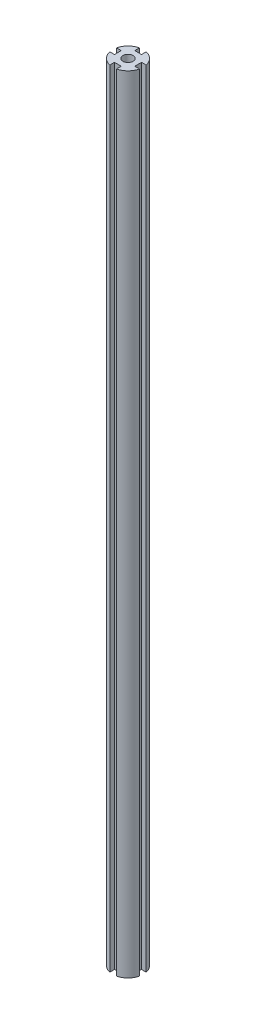
ISO-10303-21;
HEADER;
FILE_DESCRIPTION(('STEP AP214'),'2;1');
FILE_NAME('part.step','',(''),(''),'','','');
FILE_SCHEMA(('AUTOMOTIVE_DESIGN { 1 0 10303 214 1 1 1 1 }'));
ENDSEC;
DATA;
#1=APPLICATION_CONTEXT('core data for automotive mechanical design processes');
#2=APPLICATION_PROTOCOL_DEFINITION('international standard','automotive_design',2000,#1);
#3=PRODUCT_CONTEXT('',#1,'mechanical');
#4=PRODUCT('Part','Part','',(#3));
#5=PRODUCT_RELATED_PRODUCT_CATEGORY('part','',(#4));
#6=PRODUCT_DEFINITION_FORMATION('','',#4);
#7=PRODUCT_DEFINITION_CONTEXT('part definition',#1,'design');
#8=PRODUCT_DEFINITION('design','',#6,#7);
#9=PRODUCT_DEFINITION_SHAPE('','',#8);
#10=(LENGTH_UNIT() NAMED_UNIT(*) SI_UNIT(.MILLI.,.METRE.));
#11=(NAMED_UNIT(*) PLANE_ANGLE_UNIT() SI_UNIT($,.RADIAN.));
#12=(NAMED_UNIT(*) SI_UNIT($,.STERADIAN.) SOLID_ANGLE_UNIT());
#13=UNCERTAINTY_MEASURE_WITH_UNIT(LENGTH_MEASURE(1.E-05),#10,'distance_accuracy_value','');
#14=(GEOMETRIC_REPRESENTATION_CONTEXT(3) GLOBAL_UNCERTAINTY_ASSIGNED_CONTEXT((#13)) GLOBAL_UNIT_ASSIGNED_CONTEXT((#10,
#11,#12)) REPRESENTATION_CONTEXT('',''));
#15=CARTESIAN_POINT('',(0.,0.,0.));
#16=DIRECTION('',(0.,0.,1.));
#17=DIRECTION('',(1.,0.,0.));
#18=AXIS2_PLACEMENT_3D('',#15,#16,#17);
#19=CARTESIAN_POINT('',(0.,232.,0.));
#20=DIRECTION('',(0.,-1.,0.));
#21=DIRECTION('',(0.,0.,-1.));
#22=AXIS2_PLACEMENT_3D('',#19,#20,#21);
#23=CYLINDRICAL_SURFACE('',#22,4.5);
#24=CARTESIAN_POINT('',(0.,0.,0.));
#25=DIRECTION('',(0.,1.,0.));
#26=DIRECTION('',(0.,0.,1.));
#27=AXIS2_PLACEMENT_3D('',#24,#25,#26);
#28=CIRCLE('',#27,4.5);
#29=CARTESIAN_POINT('',(-4.38748219369606,0.,1.));
#30=VERTEX_POINT('',#29);
#31=CARTESIAN_POINT('',(-0.999999999999985,0.,4.38748219369606));
#32=VERTEX_POINT('',#31);
#33=EDGE_CURVE('E327',#30,#32,#28,.T.);
#34=ORIENTED_EDGE('',*,*,#33,.T.);
#35=DIRECTION('',(0.,-1.,0.));
#36=VECTOR('',#35,1.);
#37=CARTESIAN_POINT('',(-0.999999999999984,232.,4.38748219369606));
#38=LINE('',#37,#36);
#39=CARTESIAN_POINT('',(-0.999999999999985,232.,4.38748219369606));
#40=VERTEX_POINT('',#39);
#41=EDGE_CURVE('E180',#32,#40,#38,.F.);
#42=ORIENTED_EDGE('',*,*,#41,.T.);
#43=CARTESIAN_POINT('',(0.,232.,0.));
#44=DIRECTION('',(0.,1.,0.));
#45=DIRECTION('',(0.,0.,1.));
#46=AXIS2_PLACEMENT_3D('',#43,#44,#45);
#47=CIRCLE('',#46,4.5);
#48=CARTESIAN_POINT('',(-4.38748219369606,232.,1.));
#49=VERTEX_POINT('',#48);
#50=EDGE_CURVE('E320',#49,#40,#47,.T.);
#51=ORIENTED_EDGE('',*,*,#50,.F.);
#52=DIRECTION('',(0.,-1.,0.));
#53=VECTOR('',#52,1.);
#54=CARTESIAN_POINT('',(-4.38748219369606,232.,1.));
#55=LINE('',#54,#53);
#56=EDGE_CURVE('E292',#49,#30,#55,.T.);
#57=ORIENTED_EDGE('',*,*,#56,.T.);
#58=EDGE_LOOP('',(#34,#42,#51,#57));
#59=FACE_BOUND('',#58,.T.);
#60=ADVANCED_FACE('F45',(#59),#23,.T.);
#61=CARTESIAN_POINT('',(1.00000000000002,232.,4.38748219369606));
#62=VERTEX_POINT('',#61);
#63=CARTESIAN_POINT('',(4.38748219369606,232.,1.));
#64=VERTEX_POINT('',#63);
#65=EDGE_CURVE('E325',#62,#64,#47,.T.);
#66=ORIENTED_EDGE('',*,*,#65,.F.);
#67=DIRECTION('',(0.,-1.,0.));
#68=VECTOR('',#67,1.);
#69=CARTESIAN_POINT('',(1.00000000000001,232.,4.38748219369606));
#70=LINE('',#69,#68);
#71=CARTESIAN_POINT('',(1.00000000000002,0.,4.38748219369606));
#72=VERTEX_POINT('',#71);
#73=EDGE_CURVE('E263',#62,#72,#70,.T.);
#74=ORIENTED_EDGE('',*,*,#73,.T.);
#75=CARTESIAN_POINT('',(4.38748219369606,0.,1.));
#76=VERTEX_POINT('',#75);
#77=EDGE_CURVE('E330',#72,#76,#28,.T.);
#78=ORIENTED_EDGE('',*,*,#77,.T.);
#79=DIRECTION('',(0.,-1.,0.));
#80=VECTOR('',#79,1.);
#81=CARTESIAN_POINT('',(4.38748219369606,232.,1.));
#82=LINE('',#81,#80);
#83=EDGE_CURVE('E259',#76,#64,#82,.F.);
#84=ORIENTED_EDGE('',*,*,#83,.T.);
#85=EDGE_LOOP('',(#66,#74,#78,#84));
#86=FACE_BOUND('',#85,.T.);
#87=ADVANCED_FACE('F375',(#86),#23,.T.);
#88=CARTESIAN_POINT('',(4.38748219369606,232.,-1.));
#89=VERTEX_POINT('',#88);
#90=CARTESIAN_POINT('',(0.999999999999954,232.,-4.38748219369607));
#91=VERTEX_POINT('',#90);
#92=EDGE_CURVE('E349',#89,#91,#47,.T.);
#93=ORIENTED_EDGE('',*,*,#92,.F.);
#94=DIRECTION('',(0.,-1.,0.));
#95=VECTOR('',#94,1.);
#96=CARTESIAN_POINT('',(4.38748219369606,232.,-1.));
#97=LINE('',#96,#95);
#98=CARTESIAN_POINT('',(4.38748219369606,0.,-1.));
#99=VERTEX_POINT('',#98);
#100=EDGE_CURVE('E255',#89,#99,#97,.T.);
#101=ORIENTED_EDGE('',*,*,#100,.T.);
#102=CARTESIAN_POINT('',(0.999999999999954,0.,-4.38748219369607));
#103=VERTEX_POINT('',#102);
#104=EDGE_CURVE('E341',#99,#103,#28,.T.);
#105=ORIENTED_EDGE('',*,*,#104,.T.);
#106=DIRECTION('',(0.,-1.,0.));
#107=VECTOR('',#106,1.);
#108=CARTESIAN_POINT('',(0.999999999999954,232.,-4.38748219369607));
#109=LINE('',#108,#107);
#110=EDGE_CURVE('E251',#103,#91,#109,.F.);
#111=ORIENTED_EDGE('',*,*,#110,.T.);
#112=EDGE_LOOP('',(#93,#101,#105,#111));
#113=FACE_BOUND('',#112,.T.);
#114=ADVANCED_FACE('F347',(#113),#23,.T.);
#115=CARTESIAN_POINT('',(-1.00000000000005,232.,-4.38748219369605));
#116=VERTEX_POINT('',#115);
#117=CARTESIAN_POINT('',(-4.38748219369606,232.,-1.));
#118=VERTEX_POINT('',#117);
#119=EDGE_CURVE('E326',#116,#118,#47,.T.);
#120=ORIENTED_EDGE('',*,*,#119,.F.);
#121=DIRECTION('',(0.,-1.,0.));
#122=VECTOR('',#121,1.);
#123=CARTESIAN_POINT('',(-1.00000000000005,232.,-4.38748219369605));
#124=LINE('',#123,#122);
#125=CARTESIAN_POINT('',(-1.00000000000005,0.,-4.38748219369605));
#126=VERTEX_POINT('',#125);
#127=EDGE_CURVE('E173',#116,#126,#124,.T.);
#128=ORIENTED_EDGE('',*,*,#127,.T.);
#129=CARTESIAN_POINT('',(-4.38748219369606,0.,-1.));
#130=VERTEX_POINT('',#129);
#131=EDGE_CURVE('E319',#126,#130,#28,.T.);
#132=ORIENTED_EDGE('',*,*,#131,.T.);
#133=DIRECTION('',(0.,-1.,0.));
#134=VECTOR('',#133,1.);
#135=CARTESIAN_POINT('',(-4.38748219369606,232.,-1.));
#136=LINE('',#135,#134);
#137=EDGE_CURVE('E299',#130,#118,#136,.F.);
#138=ORIENTED_EDGE('',*,*,#137,.T.);
#139=EDGE_LOOP('',(#120,#128,#132,#138));
#140=FACE_BOUND('',#139,.T.);
#141=ADVANCED_FACE('F47',(#140),#23,.T.);
#142=CARTESIAN_POINT('',(0.,232.,0.));
#143=DIRECTION('',(0.,1.,0.));
#144=DIRECTION('',(0.,0.,1.));
#145=AXIS2_PLACEMENT_3D('',#142,#143,#144);
#146=PLANE('',#145);
#147=DIRECTION('',(0.,0.,1.));
#148=VECTOR('',#147,1.);
#149=CARTESIAN_POINT('',(-0.999999999999982,232.,5.));
#150=LINE('',#149,#148);
#151=CARTESIAN_POINT('',(-0.99999999999999,232.,3.));
#152=VERTEX_POINT('',#151);
#153=EDGE_CURVE('E189',#152,#40,#150,.T.);
#154=ORIENTED_EDGE('',*,*,#153,.F.);
#155=DIRECTION('',(-1.,0.,0.));
#156=VECTOR('',#155,1.);
#157=CARTESIAN_POINT('',(-0.99999999999999,232.,3.));
#158=LINE('',#157,#156);
#159=CARTESIAN_POINT('',(1.00000000000001,232.,3.));
#160=VERTEX_POINT('',#159);
#161=EDGE_CURVE('E169',#160,#152,#158,.T.);
#162=ORIENTED_EDGE('',*,*,#161,.F.);
#163=DIRECTION('',(0.,0.,-1.));
#164=VECTOR('',#163,1.);
#165=CARTESIAN_POINT('',(1.00000000000002,232.,5.));
#166=LINE('',#165,#164);
#167=EDGE_CURVE('E194',#62,#160,#166,.T.);
#168=ORIENTED_EDGE('',*,*,#167,.F.);
#169=ORIENTED_EDGE('',*,*,#65,.T.);
#170=DIRECTION('',(1.,0.,0.));
#171=VECTOR('',#170,1.);
#172=CARTESIAN_POINT('',(5.,232.,1.));
#173=LINE('',#172,#171);
#174=CARTESIAN_POINT('',(3.,232.,1.));
#175=VERTEX_POINT('',#174);
#176=EDGE_CURVE('E205',#175,#64,#173,.T.);
#177=ORIENTED_EDGE('',*,*,#176,.F.);
#178=DIRECTION('',(0.,0.,1.));
#179=VECTOR('',#178,1.);
#180=CARTESIAN_POINT('',(3.,232.,1.));
#181=LINE('',#180,#179);
#182=CARTESIAN_POINT('',(3.,232.,-1.));
#183=VERTEX_POINT('',#182);
#184=EDGE_CURVE('E213',#183,#175,#181,.T.);
#185=ORIENTED_EDGE('',*,*,#184,.F.);
#186=DIRECTION('',(-1.,0.,0.));
#187=VECTOR('',#186,1.);
#188=CARTESIAN_POINT('',(5.,232.,-1.));
#189=LINE('',#188,#187);
#190=EDGE_CURVE('E210',#89,#183,#189,.T.);
#191=ORIENTED_EDGE('',*,*,#190,.F.);
#192=ORIENTED_EDGE('',*,*,#92,.T.);
#193=DIRECTION('',(0.,0.,-1.));
#194=VECTOR('',#193,1.);
#195=CARTESIAN_POINT('',(0.999999999999948,232.,-5.00000000000001));
#196=LINE('',#195,#194);
#197=CARTESIAN_POINT('',(0.999999999999969,232.,-3.00000000000001));
#198=VERTEX_POINT('',#197);
#199=EDGE_CURVE('E229',#198,#91,#196,.T.);
#200=ORIENTED_EDGE('',*,*,#199,.F.);
#201=DIRECTION('',(1.,0.,0.));
#202=VECTOR('',#201,1.);
#203=CARTESIAN_POINT('',(0.999999999999969,232.,-3.00000000000001));
#204=LINE('',#203,#202);
#205=CARTESIAN_POINT('',(-1.00000000000003,232.,-2.99999999999999));
#206=VERTEX_POINT('',#205);
#207=EDGE_CURVE('E237',#206,#198,#204,.T.);
#208=ORIENTED_EDGE('',*,*,#207,.F.);
#209=DIRECTION('',(0.,0.,1.));
#210=VECTOR('',#209,1.);
#211=CARTESIAN_POINT('',(-1.00000000000005,232.,-4.99999999999999));
#212=LINE('',#211,#210);
#213=EDGE_CURVE('E234',#116,#206,#212,.T.);
#214=ORIENTED_EDGE('',*,*,#213,.F.);
#215=ORIENTED_EDGE('',*,*,#119,.T.);
#216=DIRECTION('',(-1.,0.,0.));
#217=VECTOR('',#216,1.);
#218=CARTESIAN_POINT('',(-5.,232.,-1.));
#219=LINE('',#218,#217);
#220=CARTESIAN_POINT('',(-3.,232.,-1.));
#221=VERTEX_POINT('',#220);
#222=EDGE_CURVE('E275',#221,#118,#219,.T.);
#223=ORIENTED_EDGE('',*,*,#222,.F.);
#224=DIRECTION('',(0.,0.,-1.));
#225=VECTOR('',#224,1.);
#226=CARTESIAN_POINT('',(-3.,232.,-1.));
#227=LINE('',#226,#225);
#228=CARTESIAN_POINT('',(-3.,232.,1.));
#229=VERTEX_POINT('',#228);
#230=EDGE_CURVE('E282',#229,#221,#227,.T.);
#231=ORIENTED_EDGE('',*,*,#230,.F.);
#232=DIRECTION('',(1.,0.,0.));
#233=VECTOR('',#232,1.);
#234=CARTESIAN_POINT('',(-5.,232.,1.));
#235=LINE('',#234,#233);
#236=EDGE_CURVE('E269',#49,#229,#235,.T.);
#237=ORIENTED_EDGE('',*,*,#236,.F.);
#238=ORIENTED_EDGE('',*,*,#50,.T.);
#239=EDGE_LOOP('',(#154,#162,#168,#169,#177,#185,#191,#192,#200,#208,#214,#215,#223,#231,#237,#238));
#240=FACE_BOUND('',#239,.T.);
#241=CARTESIAN_POINT('',(0.,232.,0.));
#242=DIRECTION('',(0.,1.,0.));
#243=DIRECTION('',(0.,0.,1.));
#244=AXIS2_PLACEMENT_3D('',#241,#242,#243);
#245=CIRCLE('',#244,1.5);
#246=CARTESIAN_POINT('',(0.,232.,1.5));
#247=VERTEX_POINT('',#246);
#248=EDGE_CURVE('E303',#247,#247,#245,.T.);
#249=ORIENTED_EDGE('',*,*,#248,.F.);
#250=EDGE_LOOP('',(#249));
#251=FACE_BOUND('',#250,.T.);
#252=ADVANCED_FACE('F359',(#240,#251),#146,.T.);
#253=CARTESIAN_POINT('',(0.,0.,0.));
#254=DIRECTION('',(0.,1.,0.));
#255=DIRECTION('',(0.,0.,1.));
#256=AXIS2_PLACEMENT_3D('',#253,#254,#255);
#257=PLANE('',#256);
#258=CARTESIAN_POINT('',(0.,0.,0.));
#259=DIRECTION('',(0.,-1.,0.));
#260=DIRECTION('',(0.,0.,-1.));
#261=AXIS2_PLACEMENT_3D('',#258,#259,#260);
#262=CIRCLE('',#261,1.5);
#263=CARTESIAN_POINT('',(0.,0.,-1.5));
#264=VERTEX_POINT('',#263);
#265=EDGE_CURVE('E311',#264,#264,#262,.T.);
#266=ORIENTED_EDGE('',*,*,#265,.F.);
#267=EDGE_LOOP('',(#266));
#268=FACE_BOUND('',#267,.T.);
#269=DIRECTION('',(-1.,0.,0.));
#270=VECTOR('',#269,1.);
#271=CARTESIAN_POINT('',(-0.99999999999999,0.,3.));
#272=LINE('',#271,#270);
#273=CARTESIAN_POINT('',(1.00000000000001,0.,3.));
#274=VERTEX_POINT('',#273);
#275=CARTESIAN_POINT('',(-0.99999999999999,0.,3.));
#276=VERTEX_POINT('',#275);
#277=EDGE_CURVE('E61',#274,#276,#272,.T.);
#278=ORIENTED_EDGE('',*,*,#277,.T.);
#279=DIRECTION('',(0.,0.,1.));
#280=VECTOR('',#279,1.);
#281=CARTESIAN_POINT('',(-0.999999999999982,0.,5.));
#282=LINE('',#281,#280);
#283=EDGE_CURVE('E177',#276,#32,#282,.T.);
#284=ORIENTED_EDGE('',*,*,#283,.T.);
#285=ORIENTED_EDGE('',*,*,#33,.F.);
#286=DIRECTION('',(1.,0.,0.));
#287=VECTOR('',#286,1.);
#288=CARTESIAN_POINT('',(0.,0.,1.));
#289=LINE('',#288,#287);
#290=CARTESIAN_POINT('',(-3.,0.,1.));
#291=VERTEX_POINT('',#290);
#292=EDGE_CURVE('E324',#30,#291,#289,.T.);
#293=ORIENTED_EDGE('',*,*,#292,.T.);
#294=DIRECTION('',(0.,0.,-1.));
#295=VECTOR('',#294,1.);
#296=CARTESIAN_POINT('',(-3.,0.,-1.));
#297=LINE('',#296,#295);
#298=CARTESIAN_POINT('',(-3.,0.,-1.));
#299=VERTEX_POINT('',#298);
#300=EDGE_CURVE('E270',#291,#299,#297,.T.);
#301=ORIENTED_EDGE('',*,*,#300,.T.);
#302=DIRECTION('',(-1.,0.,0.));
#303=VECTOR('',#302,1.);
#304=CARTESIAN_POINT('',(-5.,0.,-1.));
#305=LINE('',#304,#303);
#306=EDGE_CURVE('E274',#299,#130,#305,.T.);
#307=ORIENTED_EDGE('',*,*,#306,.T.);
#308=ORIENTED_EDGE('',*,*,#131,.F.);
#309=DIRECTION('',(0.,0.,1.));
#310=VECTOR('',#309,1.);
#311=CARTESIAN_POINT('',(-1.,0.,0.));
#312=LINE('',#311,#310);
#313=CARTESIAN_POINT('',(-1.00000000000003,0.,-2.99999999999999));
#314=VERTEX_POINT('',#313);
#315=EDGE_CURVE('E334',#126,#314,#312,.T.);
#316=ORIENTED_EDGE('',*,*,#315,.T.);
#317=DIRECTION('',(1.,0.,0.));
#318=VECTOR('',#317,1.);
#319=CARTESIAN_POINT('',(0.999999999999969,0.,-3.00000000000001));
#320=LINE('',#319,#318);
#321=CARTESIAN_POINT('',(0.999999999999969,0.,-3.00000000000001));
#322=VERTEX_POINT('',#321);
#323=EDGE_CURVE('E224',#314,#322,#320,.T.);
#324=ORIENTED_EDGE('',*,*,#323,.T.);
#325=DIRECTION('',(0.,0.,-1.));
#326=VECTOR('',#325,1.);
#327=CARTESIAN_POINT('',(0.999999999999948,0.,-5.00000000000001));
#328=LINE('',#327,#326);
#329=EDGE_CURVE('E228',#322,#103,#328,.T.);
#330=ORIENTED_EDGE('',*,*,#329,.T.);
#331=ORIENTED_EDGE('',*,*,#104,.F.);
#332=DIRECTION('',(-1.,0.,0.));
#333=VECTOR('',#332,1.);
#334=CARTESIAN_POINT('',(0.,0.,-1.));
#335=LINE('',#334,#333);
#336=CARTESIAN_POINT('',(3.,0.,-1.));
#337=VERTEX_POINT('',#336);
#338=EDGE_CURVE('E54',#99,#337,#335,.T.);
#339=ORIENTED_EDGE('',*,*,#338,.T.);
#340=DIRECTION('',(0.,0.,1.));
#341=VECTOR('',#340,1.);
#342=CARTESIAN_POINT('',(3.,0.,1.));
#343=LINE('',#342,#341);
#344=CARTESIAN_POINT('',(3.,0.,1.));
#345=VERTEX_POINT('',#344);
#346=EDGE_CURVE('E69',#337,#345,#343,.T.);
#347=ORIENTED_EDGE('',*,*,#346,.T.);
#348=DIRECTION('',(1.,0.,0.));
#349=VECTOR('',#348,1.);
#350=CARTESIAN_POINT('',(5.,0.,1.));
#351=LINE('',#350,#349);
#352=EDGE_CURVE('E204',#345,#76,#351,.T.);
#353=ORIENTED_EDGE('',*,*,#352,.T.);
#354=ORIENTED_EDGE('',*,*,#77,.F.);
#355=DIRECTION('',(0.,0.,-1.));
#356=VECTOR('',#355,1.);
#357=CARTESIAN_POINT('',(1.,0.,0.));
#358=LINE('',#357,#356);
#359=EDGE_CURVE('E11',#72,#274,#358,.T.);
#360=ORIENTED_EDGE('',*,*,#359,.T.);
#361=EDGE_LOOP('',(#278,#284,#285,#293,#301,#307,#308,#316,#324,#330,#331,#339,#347,#353,#354,#360));
#362=FACE_BOUND('',#361,.T.);
#363=ADVANCED_FACE('F186',(#268,#362),#257,.F.);
#364=CARTESIAN_POINT('',(0.,3.,0.));
#365=DIRECTION('',(0.,-1.,0.));
#366=DIRECTION('',(0.,0.,-1.));
#367=AXIS2_PLACEMENT_3D('',#364,#365,#366);
#368=CONICAL_SURFACE('',#367,1.5,1.02974425867665);
#369=CARTESIAN_POINT('',(0.,3.90129092854134,0.));
#370=VERTEX_POINT('',#369);
#371=VERTEX_LOOP('',#370);
#372=FACE_BOUND('',#371,.T.);
#373=CARTESIAN_POINT('',(0.,3.,0.));
#374=DIRECTION('',(0.,-1.,0.));
#375=DIRECTION('',(0.,0.,-1.));
#376=AXIS2_PLACEMENT_3D('',#373,#374,#375);
#377=CIRCLE('',#376,1.5);
#378=CARTESIAN_POINT('',(0.,3.,-1.5));
#379=VERTEX_POINT('',#378);
#380=EDGE_CURVE('E315',#379,#379,#377,.T.);
#381=ORIENTED_EDGE('',*,*,#380,.T.);
#382=EDGE_LOOP('',(#381));
#383=FACE_BOUND('',#382,.T.);
#384=ADVANCED_FACE('F515',(#372,#383),#368,.F.);
#385=CARTESIAN_POINT('',(0.,0.,0.));
#386=DIRECTION('',(0.,-1.,0.));
#387=DIRECTION('',(0.,0.,-1.));
#388=AXIS2_PLACEMENT_3D('',#385,#386,#387);
#389=CYLINDRICAL_SURFACE('',#388,1.5);
#390=ORIENTED_EDGE('',*,*,#380,.F.);
#391=EDGE_LOOP('',(#390));
#392=FACE_BOUND('',#391,.T.);
#393=ORIENTED_EDGE('',*,*,#265,.T.);
#394=EDGE_LOOP('',(#393));
#395=FACE_BOUND('',#394,.T.);
#396=ADVANCED_FACE('F511',(#392,#395),#389,.F.);
#397=CARTESIAN_POINT('',(0.,229.,0.));
#398=DIRECTION('',(0.,1.,0.));
#399=DIRECTION('',(0.,0.,1.));
#400=AXIS2_PLACEMENT_3D('',#397,#398,#399);
#401=CONICAL_SURFACE('',#400,1.5,1.02974425867666);
#402=CARTESIAN_POINT('',(0.,228.098709071459,0.));
#403=VERTEX_POINT('',#402);
#404=VERTEX_LOOP('',#403);
#405=FACE_BOUND('',#404,.T.);
#406=CARTESIAN_POINT('',(0.,229.,0.));
#407=DIRECTION('',(0.,1.,0.));
#408=DIRECTION('',(0.,0.,1.));
#409=AXIS2_PLACEMENT_3D('',#406,#407,#408);
#410=CIRCLE('',#409,1.5);
#411=CARTESIAN_POINT('',(0.,229.,1.5));
#412=VERTEX_POINT('',#411);
#413=EDGE_CURVE('E307',#412,#412,#410,.T.);
#414=ORIENTED_EDGE('',*,*,#413,.T.);
#415=EDGE_LOOP('',(#414));
#416=FACE_BOUND('',#415,.T.);
#417=ADVANCED_FACE('F507',(#405,#416),#401,.F.);
#418=CARTESIAN_POINT('',(0.,232.,0.));
#419=DIRECTION('',(0.,1.,0.));
#420=DIRECTION('',(0.,0.,1.));
#421=AXIS2_PLACEMENT_3D('',#418,#419,#420);
#422=CYLINDRICAL_SURFACE('',#421,1.5);
#423=ORIENTED_EDGE('',*,*,#413,.F.);
#424=EDGE_LOOP('',(#423));
#425=FACE_BOUND('',#424,.T.);
#426=ORIENTED_EDGE('',*,*,#248,.T.);
#427=EDGE_LOOP('',(#426));
#428=FACE_BOUND('',#427,.T.);
#429=ADVANCED_FACE('F499',(#425,#428),#422,.F.);
#430=CARTESIAN_POINT('',(-5.,0.,-1.));
#431=DIRECTION('',(0.,0.,-1.));
#432=DIRECTION('',(-1.,0.,0.));
#433=AXIS2_PLACEMENT_3D('',#430,#431,#432);
#434=PLANE('',#433);
#435=ORIENTED_EDGE('',*,*,#306,.F.);
#436=DIRECTION('',(0.,1.,0.));
#437=VECTOR('',#436,1.);
#438=CARTESIAN_POINT('',(-3.,0.,-1.));
#439=LINE('',#438,#437);
#440=EDGE_CURVE('E289',#299,#221,#439,.T.);
#441=ORIENTED_EDGE('',*,*,#440,.T.);
#442=ORIENTED_EDGE('',*,*,#222,.T.);
#443=ORIENTED_EDGE('',*,*,#137,.F.);
#444=EDGE_LOOP('',(#435,#441,#442,#443));
#445=FACE_BOUND('',#444,.T.);
#446=ADVANCED_FACE('F367',(#445),#434,.F.);
#447=CARTESIAN_POINT('',(-5.,0.,1.));
#448=DIRECTION('',(0.,0.,1.));
#449=DIRECTION('',(1.,0.,0.));
#450=AXIS2_PLACEMENT_3D('',#447,#448,#449);
#451=PLANE('',#450);
#452=ORIENTED_EDGE('',*,*,#236,.T.);
#453=DIRECTION('',(0.,1.,0.));
#454=VECTOR('',#453,1.);
#455=CARTESIAN_POINT('',(-3.,0.,1.));
#456=LINE('',#455,#454);
#457=EDGE_CURVE('E279',#291,#229,#456,.T.);
#458=ORIENTED_EDGE('',*,*,#457,.F.);
#459=ORIENTED_EDGE('',*,*,#292,.F.);
#460=ORIENTED_EDGE('',*,*,#56,.F.);
#461=EDGE_LOOP('',(#452,#458,#459,#460));
#462=FACE_BOUND('',#461,.T.);
#463=ADVANCED_FACE('F498',(#462),#451,.F.);
#464=CARTESIAN_POINT('',(-3.,0.,-1.));
#465=DIRECTION('',(1.,0.,0.));
#466=DIRECTION('',(0.,0.,-1.));
#467=AXIS2_PLACEMENT_3D('',#464,#465,#466);
#468=PLANE('',#467);
#469=ORIENTED_EDGE('',*,*,#230,.T.);
#470=ORIENTED_EDGE('',*,*,#440,.F.);
#471=ORIENTED_EDGE('',*,*,#300,.F.);
#472=ORIENTED_EDGE('',*,*,#457,.T.);
#473=EDGE_LOOP('',(#469,#470,#471,#472));
#474=FACE_BOUND('',#473,.T.);
#475=ADVANCED_FACE('F432',(#474),#468,.F.);
#476=CARTESIAN_POINT('',(0.999999999999948,0.,-5.00000000000001));
#477=DIRECTION('',(1.,0.,0.));
#478=DIRECTION('',(0.,0.,-1.));
#479=AXIS2_PLACEMENT_3D('',#476,#477,#478);
#480=PLANE('',#479);
#481=ORIENTED_EDGE('',*,*,#329,.F.);
#482=DIRECTION('',(0.,1.,0.));
#483=VECTOR('',#482,1.);
#484=CARTESIAN_POINT('',(0.999999999999969,0.,-3.00000000000001));
#485=LINE('',#484,#483);
#486=EDGE_CURVE('E214',#322,#198,#485,.T.);
#487=ORIENTED_EDGE('',*,*,#486,.T.);
#488=ORIENTED_EDGE('',*,*,#199,.T.);
#489=ORIENTED_EDGE('',*,*,#110,.F.);
#490=EDGE_LOOP('',(#481,#487,#488,#489));
#491=FACE_BOUND('',#490,.T.);
#492=ADVANCED_FACE('F426',(#491),#480,.F.);
#493=CARTESIAN_POINT('',(-1.00000000000005,0.,-4.99999999999999));
#494=DIRECTION('',(-1.,0.,0.));
#495=DIRECTION('',(0.,0.,1.));
#496=AXIS2_PLACEMENT_3D('',#493,#494,#495);
#497=PLANE('',#496);
#498=ORIENTED_EDGE('',*,*,#213,.T.);
#499=DIRECTION('',(0.,1.,0.));
#500=VECTOR('',#499,1.);
#501=CARTESIAN_POINT('',(-1.00000000000003,0.,-2.99999999999999));
#502=LINE('',#501,#500);
#503=EDGE_CURVE('E233',#314,#206,#502,.T.);
#504=ORIENTED_EDGE('',*,*,#503,.F.);
#505=ORIENTED_EDGE('',*,*,#315,.F.);
#506=ORIENTED_EDGE('',*,*,#127,.F.);
#507=EDGE_LOOP('',(#498,#504,#505,#506));
#508=FACE_BOUND('',#507,.T.);
#509=ADVANCED_FACE('F431',(#508),#497,.F.);
#510=CARTESIAN_POINT('',(0.999999999999969,0.,-3.00000000000001));
#511=DIRECTION('',(0.,0.,1.));
#512=DIRECTION('',(1.,0.,0.));
#513=AXIS2_PLACEMENT_3D('',#510,#511,#512);
#514=PLANE('',#513);
#515=ORIENTED_EDGE('',*,*,#207,.T.);
#516=ORIENTED_EDGE('',*,*,#486,.F.);
#517=ORIENTED_EDGE('',*,*,#323,.F.);
#518=ORIENTED_EDGE('',*,*,#503,.T.);
#519=EDGE_LOOP('',(#515,#516,#517,#518));
#520=FACE_BOUND('',#519,.T.);
#521=ADVANCED_FACE('F443',(#520),#514,.F.);
#522=CARTESIAN_POINT('',(5.,0.,1.));
#523=DIRECTION('',(0.,0.,1.));
#524=DIRECTION('',(1.,0.,0.));
#525=AXIS2_PLACEMENT_3D('',#522,#523,#524);
#526=PLANE('',#525);
#527=ORIENTED_EDGE('',*,*,#352,.F.);
#528=DIRECTION('',(0.,1.,0.));
#529=VECTOR('',#528,1.);
#530=CARTESIAN_POINT('',(3.,0.,1.));
#531=LINE('',#530,#529);
#532=EDGE_CURVE('E197',#345,#175,#531,.T.);
#533=ORIENTED_EDGE('',*,*,#532,.T.);
#534=ORIENTED_EDGE('',*,*,#176,.T.);
#535=ORIENTED_EDGE('',*,*,#83,.F.);
#536=EDGE_LOOP('',(#527,#533,#534,#535));
#537=FACE_BOUND('',#536,.T.);
#538=ADVANCED_FACE('F378',(#537),#526,.F.);
#539=CARTESIAN_POINT('',(5.,0.,-1.));
#540=DIRECTION('',(0.,0.,-1.));
#541=DIRECTION('',(-1.,0.,0.));
#542=AXIS2_PLACEMENT_3D('',#539,#540,#541);
#543=PLANE('',#542);
#544=ORIENTED_EDGE('',*,*,#190,.T.);
#545=DIRECTION('',(0.,1.,0.));
#546=VECTOR('',#545,1.);
#547=CARTESIAN_POINT('',(3.,0.,-1.));
#548=LINE('',#547,#546);
#549=EDGE_CURVE('E209',#337,#183,#548,.T.);
#550=ORIENTED_EDGE('',*,*,#549,.F.);
#551=ORIENTED_EDGE('',*,*,#338,.F.);
#552=ORIENTED_EDGE('',*,*,#100,.F.);
#553=EDGE_LOOP('',(#544,#550,#551,#552));
#554=FACE_BOUND('',#553,.T.);
#555=ADVANCED_FACE('F343',(#554),#543,.F.);
#556=CARTESIAN_POINT('',(3.,0.,1.));
#557=DIRECTION('',(-1.,0.,0.));
#558=DIRECTION('',(0.,0.,1.));
#559=AXIS2_PLACEMENT_3D('',#556,#557,#558);
#560=PLANE('',#559);
#561=ORIENTED_EDGE('',*,*,#184,.T.);
#562=ORIENTED_EDGE('',*,*,#532,.F.);
#563=ORIENTED_EDGE('',*,*,#346,.F.);
#564=ORIENTED_EDGE('',*,*,#549,.T.);
#565=EDGE_LOOP('',(#561,#562,#563,#564));
#566=FACE_BOUND('',#565,.T.);
#567=ADVANCED_FACE('F391',(#566),#560,.F.);
#568=CARTESIAN_POINT('',(-0.999999999999982,0.,5.));
#569=DIRECTION('',(-1.,0.,0.));
#570=DIRECTION('',(0.,0.,1.));
#571=AXIS2_PLACEMENT_3D('',#568,#569,#570);
#572=PLANE('',#571);
#573=ORIENTED_EDGE('',*,*,#283,.F.);
#574=DIRECTION('',(0.,1.,0.));
#575=VECTOR('',#574,1.);
#576=CARTESIAN_POINT('',(-0.99999999999999,0.,3.));
#577=LINE('',#576,#575);
#578=EDGE_CURVE('E165',#276,#152,#577,.T.);
#579=ORIENTED_EDGE('',*,*,#578,.T.);
#580=ORIENTED_EDGE('',*,*,#153,.T.);
#581=ORIENTED_EDGE('',*,*,#41,.F.);
#582=EDGE_LOOP('',(#573,#579,#580,#581));
#583=FACE_BOUND('',#582,.T.);
#584=ADVANCED_FACE('F178',(#583),#572,.F.);
#585=CARTESIAN_POINT('',(1.00000000000002,0.,5.));
#586=DIRECTION('',(1.,0.,0.));
#587=DIRECTION('',(0.,0.,-1.));
#588=AXIS2_PLACEMENT_3D('',#585,#586,#587);
#589=PLANE('',#588);
#590=ORIENTED_EDGE('',*,*,#167,.T.);
#591=DIRECTION('',(0.,1.,0.));
#592=VECTOR('',#591,1.);
#593=CARTESIAN_POINT('',(1.00000000000001,0.,3.));
#594=LINE('',#593,#592);
#595=EDGE_CURVE('E174',#274,#160,#594,.T.);
#596=ORIENTED_EDGE('',*,*,#595,.F.);
#597=ORIENTED_EDGE('',*,*,#359,.F.);
#598=ORIENTED_EDGE('',*,*,#73,.F.);
#599=EDGE_LOOP('',(#590,#596,#597,#598));
#600=FACE_BOUND('',#599,.T.);
#601=ADVANCED_FACE('F383',(#600),#589,.F.);
#602=CARTESIAN_POINT('',(-0.99999999999999,0.,3.));
#603=DIRECTION('',(0.,0.,-1.));
#604=DIRECTION('',(-1.,0.,0.));
#605=AXIS2_PLACEMENT_3D('',#602,#603,#604);
#606=PLANE('',#605);
#607=ORIENTED_EDGE('',*,*,#161,.T.);
#608=ORIENTED_EDGE('',*,*,#578,.F.);
#609=ORIENTED_EDGE('',*,*,#277,.F.);
#610=ORIENTED_EDGE('',*,*,#595,.T.);
#611=EDGE_LOOP('',(#607,#608,#609,#610));
#612=FACE_BOUND('',#611,.T.);
#613=ADVANCED_FACE('F167',(#612),#606,.F.);
#614=CLOSED_SHELL('',(#60,#87,#114,#141,#252,#363,#384,#396,#417,#429,#446,#463,#475,#492,#509,
#521,#538,#555,#567,#584,#601,#613));
#615=MANIFOLD_SOLID_BREP('B2',#614);
#616=ADVANCED_BREP_SHAPE_REPRESENTATION('',(#18,#615),#14);
#617=SHAPE_DEFINITION_REPRESENTATION(#9,#616);
ENDSEC;
END-ISO-10303-21;
